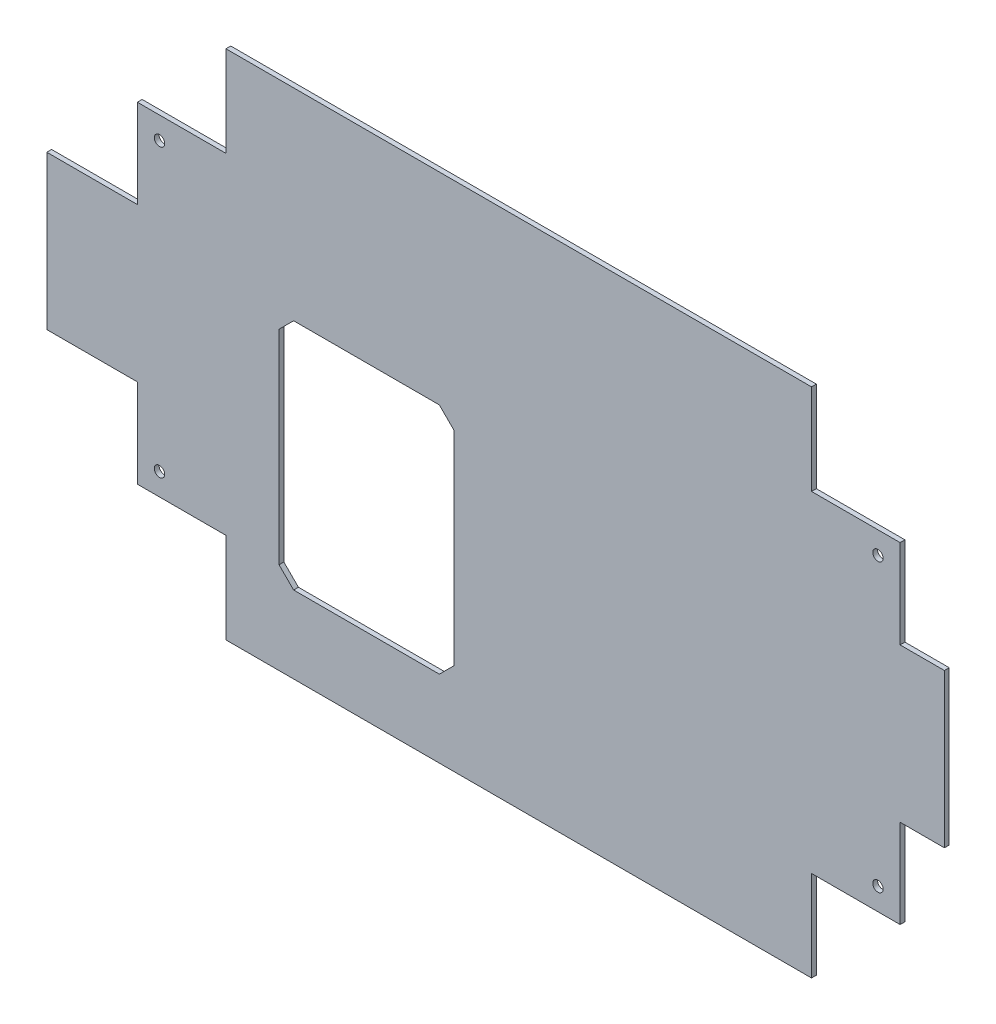
ISO-10303-21;
HEADER;
FILE_DESCRIPTION(('STEP AP214'),'2;1');
FILE_NAME('part.step','',(''),(''),'','','');
FILE_SCHEMA(('AUTOMOTIVE_DESIGN { 1 0 10303 214 1 1 1 1 }'));
ENDSEC;
DATA;
#1=APPLICATION_CONTEXT('core data for automotive mechanical design processes');
#2=APPLICATION_PROTOCOL_DEFINITION('international standard','automotive_design',2000,#1);
#3=PRODUCT_CONTEXT('',#1,'mechanical');
#4=PRODUCT('Part','Part','',(#3));
#5=PRODUCT_RELATED_PRODUCT_CATEGORY('part','',(#4));
#6=PRODUCT_DEFINITION_FORMATION('','',#4);
#7=PRODUCT_DEFINITION_CONTEXT('part definition',#1,'design');
#8=PRODUCT_DEFINITION('design','',#6,#7);
#9=PRODUCT_DEFINITION_SHAPE('','',#8);
#10=(LENGTH_UNIT() NAMED_UNIT(*) SI_UNIT(.MILLI.,.METRE.));
#11=(NAMED_UNIT(*) PLANE_ANGLE_UNIT() SI_UNIT($,.RADIAN.));
#12=(NAMED_UNIT(*) SI_UNIT($,.STERADIAN.) SOLID_ANGLE_UNIT());
#13=UNCERTAINTY_MEASURE_WITH_UNIT(LENGTH_MEASURE(1.E-05),#10,'distance_accuracy_value','');
#14=(GEOMETRIC_REPRESENTATION_CONTEXT(3) GLOBAL_UNCERTAINTY_ASSIGNED_CONTEXT((#13)) GLOBAL_UNIT_ASSIGNED_CONTEXT((#10,
#11,#12)) REPRESENTATION_CONTEXT('',''));
#15=CARTESIAN_POINT('',(0.,0.,0.));
#16=DIRECTION('',(0.,0.,1.));
#17=DIRECTION('',(1.,0.,0.));
#18=AXIS2_PLACEMENT_3D('',#15,#16,#17);
#19=CARTESIAN_POINT('',(-615.949999999996,52.7000000000001,3.3));
#20=DIRECTION('',(0.,-1.,0.));
#21=DIRECTION('',(1.,0.,0.));
#22=AXIS2_PLACEMENT_3D('',#19,#20,#21);
#23=PLANE('',#22);
#24=DIRECTION('',(-1.,0.,0.));
#25=VECTOR('',#24,1.);
#26=CARTESIAN_POINT('',(-615.949999999996,52.7000000000001,0.));
#27=LINE('',#26,#25);
#28=CARTESIAN_POINT('',(-553.799999999996,52.7,0.));
#29=VERTEX_POINT('',#28);
#30=CARTESIAN_POINT('',(-615.949999999996,52.7000000000001,0.));
#31=VERTEX_POINT('',#30);
#32=EDGE_CURVE('E288',#29,#31,#27,.T.);
#33=ORIENTED_EDGE('',*,*,#32,.T.);
#34=DIRECTION('',(0.,0.,-1.));
#35=VECTOR('',#34,1.);
#36=CARTESIAN_POINT('',(-615.949999999996,52.7000000000001,3.3));
#37=LINE('',#36,#35);
#38=CARTESIAN_POINT('',(-615.949999999996,52.7000000000001,3.3));
#39=VERTEX_POINT('',#38);
#40=EDGE_CURVE('E404',#39,#31,#37,.T.);
#41=ORIENTED_EDGE('',*,*,#40,.F.);
#42=DIRECTION('',(-1.,0.,0.));
#43=VECTOR('',#42,1.);
#44=CARTESIAN_POINT('',(-615.949999999996,52.7000000000001,3.3));
#45=LINE('',#44,#43);
#46=CARTESIAN_POINT('',(-553.799999999996,52.7,3.3));
#47=VERTEX_POINT('',#46);
#48=EDGE_CURVE('E290',#47,#39,#45,.T.);
#49=ORIENTED_EDGE('',*,*,#48,.F.);
#50=DIRECTION('',(0.,0.,-1.));
#51=VECTOR('',#50,1.);
#52=CARTESIAN_POINT('',(-553.799999999996,52.7,3.3));
#53=LINE('',#52,#51);
#54=EDGE_CURVE('E329',#47,#29,#53,.T.);
#55=ORIENTED_EDGE('',*,*,#54,.T.);
#56=EDGE_LOOP('',(#33,#41,#49,#55));
#57=FACE_BOUND('',#56,.T.);
#58=ADVANCED_FACE('F33',(#57),#23,.F.);
#59=CARTESIAN_POINT('',(-615.949999999996,52.7000000000001,3.3));
#60=DIRECTION('',(1.,0.,0.));
#61=DIRECTION('',(0.,0.,-1.));
#62=AXIS2_PLACEMENT_3D('',#59,#60,#61);
#63=PLANE('',#62);
#64=DIRECTION('',(0.,-1.,0.));
#65=VECTOR('',#64,1.);
#66=CARTESIAN_POINT('',(-615.949999999996,52.7000000000001,0.));
#67=LINE('',#66,#65);
#68=CARTESIAN_POINT('',(-615.949999999996,-52.6999999999999,0.));
#69=VERTEX_POINT('',#68);
#70=EDGE_CURVE('E332',#31,#69,#67,.T.);
#71=ORIENTED_EDGE('',*,*,#70,.T.);
#72=DIRECTION('',(0.,0.,-1.));
#73=VECTOR('',#72,1.);
#74=CARTESIAN_POINT('',(-615.949999999996,-52.6999999999999,3.3));
#75=LINE('',#74,#73);
#76=CARTESIAN_POINT('',(-615.949999999996,-52.6999999999999,3.3));
#77=VERTEX_POINT('',#76);
#78=EDGE_CURVE('E401',#77,#69,#75,.T.);
#79=ORIENTED_EDGE('',*,*,#78,.F.);
#80=DIRECTION('',(0.,-1.,0.));
#81=VECTOR('',#80,1.);
#82=CARTESIAN_POINT('',(-615.949999999996,52.7000000000001,3.3));
#83=LINE('',#82,#81);
#84=EDGE_CURVE('E293',#39,#77,#83,.T.);
#85=ORIENTED_EDGE('',*,*,#84,.F.);
#86=ORIENTED_EDGE('',*,*,#40,.T.);
#87=EDGE_LOOP('',(#71,#79,#85,#86));
#88=FACE_BOUND('',#87,.T.);
#89=ADVANCED_FACE('F488',(#88),#63,.F.);
#90=CARTESIAN_POINT('',(-615.949999999996,-52.6999999999999,3.3));
#91=DIRECTION('',(0.,1.,0.));
#92=DIRECTION('',(0.,0.,1.));
#93=AXIS2_PLACEMENT_3D('',#90,#91,#92);
#94=PLANE('',#93);
#95=DIRECTION('',(1.,0.,0.));
#96=VECTOR('',#95,1.);
#97=CARTESIAN_POINT('',(-615.949999999996,-52.6999999999999,0.));
#98=LINE('',#97,#96);
#99=CARTESIAN_POINT('',(-553.799999999996,-52.6999999999999,0.));
#100=VERTEX_POINT('',#99);
#101=EDGE_CURVE('E334',#69,#100,#98,.T.);
#102=ORIENTED_EDGE('',*,*,#101,.T.);
#103=DIRECTION('',(0.,0.,-1.));
#104=VECTOR('',#103,1.);
#105=CARTESIAN_POINT('',(-553.799999999996,-52.6999999999999,3.3));
#106=LINE('',#105,#104);
#107=CARTESIAN_POINT('',(-553.799999999996,-52.6999999999999,3.3));
#108=VERTEX_POINT('',#107);
#109=EDGE_CURVE('E398',#108,#100,#106,.T.);
#110=ORIENTED_EDGE('',*,*,#109,.F.);
#111=DIRECTION('',(1.,0.,0.));
#112=VECTOR('',#111,1.);
#113=CARTESIAN_POINT('',(-615.949999999996,-52.6999999999999,3.3));
#114=LINE('',#113,#112);
#115=EDGE_CURVE('E296',#77,#108,#114,.T.);
#116=ORIENTED_EDGE('',*,*,#115,.F.);
#117=ORIENTED_EDGE('',*,*,#78,.T.);
#118=EDGE_LOOP('',(#102,#110,#116,#117));
#119=FACE_BOUND('',#118,.T.);
#120=ADVANCED_FACE('F494',(#119),#94,.F.);
#121=CARTESIAN_POINT('',(-553.799999999996,-52.6999999999999,3.3));
#122=DIRECTION('',(1.,0.,0.));
#123=DIRECTION('',(0.,0.,-1.));
#124=AXIS2_PLACEMENT_3D('',#121,#122,#123);
#125=PLANE('',#124);
#126=DIRECTION('',(0.,-1.,0.));
#127=VECTOR('',#126,1.);
#128=CARTESIAN_POINT('',(-553.799999999996,-52.6999999999999,0.));
#129=LINE('',#128,#127);
#130=CARTESIAN_POINT('',(-553.799999999996,-113.5,0.));
#131=VERTEX_POINT('',#130);
#132=EDGE_CURVE('E336',#100,#131,#129,.T.);
#133=ORIENTED_EDGE('',*,*,#132,.T.);
#134=DIRECTION('',(0.,0.,-1.));
#135=VECTOR('',#134,1.);
#136=CARTESIAN_POINT('',(-553.799999999996,-113.5,3.3));
#137=LINE('',#136,#135);
#138=CARTESIAN_POINT('',(-553.799999999996,-113.5,3.3));
#139=VERTEX_POINT('',#138);
#140=EDGE_CURVE('E395',#139,#131,#137,.T.);
#141=ORIENTED_EDGE('',*,*,#140,.F.);
#142=DIRECTION('',(0.,-1.,0.));
#143=VECTOR('',#142,1.);
#144=CARTESIAN_POINT('',(-553.799999999996,-52.6999999999999,3.3));
#145=LINE('',#144,#143);
#146=EDGE_CURVE('E298',#108,#139,#145,.T.);
#147=ORIENTED_EDGE('',*,*,#146,.F.);
#148=ORIENTED_EDGE('',*,*,#109,.T.);
#149=EDGE_LOOP('',(#133,#141,#147,#148));
#150=FACE_BOUND('',#149,.T.);
#151=ADVANCED_FACE('F598',(#150),#125,.F.);
#152=CARTESIAN_POINT('',(-553.799999999996,-113.5,3.3));
#153=DIRECTION('',(0.,1.,0.));
#154=DIRECTION('',(-1.,0.,0.));
#155=AXIS2_PLACEMENT_3D('',#152,#153,#154);
#156=PLANE('',#155);
#157=DIRECTION('',(1.,0.,0.));
#158=VECTOR('',#157,1.);
#159=CARTESIAN_POINT('',(-553.799999999996,-113.5,0.));
#160=LINE('',#159,#158);
#161=CARTESIAN_POINT('',(-492.999999999998,-113.5,0.));
#162=VERTEX_POINT('',#161);
#163=EDGE_CURVE('E232',#131,#162,#160,.T.);
#164=ORIENTED_EDGE('',*,*,#163,.T.);
#165=DIRECTION('',(0.,0.,-1.));
#166=VECTOR('',#165,1.);
#167=CARTESIAN_POINT('',(-492.999999999998,-113.5,3.3));
#168=LINE('',#167,#166);
#169=CARTESIAN_POINT('',(-492.999999999998,-113.5,3.3));
#170=VERTEX_POINT('',#169);
#171=EDGE_CURVE('E227',#170,#162,#168,.T.);
#172=ORIENTED_EDGE('',*,*,#171,.F.);
#173=DIRECTION('',(1.,0.,0.));
#174=VECTOR('',#173,1.);
#175=CARTESIAN_POINT('',(-553.799999999996,-113.5,3.3));
#176=LINE('',#175,#174);
#177=EDGE_CURVE('E300',#139,#170,#176,.T.);
#178=ORIENTED_EDGE('',*,*,#177,.F.);
#179=ORIENTED_EDGE('',*,*,#140,.T.);
#180=EDGE_LOOP('',(#164,#172,#178,#179));
#181=FACE_BOUND('',#180,.T.);
#182=ADVANCED_FACE('F595',(#181),#156,.F.);
#183=CARTESIAN_POINT('',(-492.999999999998,-113.5,3.3));
#184=DIRECTION('',(1.,0.,0.));
#185=DIRECTION('',(0.,1.,0.));
#186=AXIS2_PLACEMENT_3D('',#183,#184,#185);
#187=PLANE('',#186);
#188=DIRECTION('',(0.,-1.,0.));
#189=VECTOR('',#188,1.);
#190=CARTESIAN_POINT('',(-492.999999999998,-113.5,0.));
#191=LINE('',#190,#189);
#192=CARTESIAN_POINT('',(-492.999999999998,-175.65,0.));
#193=VERTEX_POINT('',#192);
#194=EDGE_CURVE('E220',#162,#193,#191,.T.);
#195=ORIENTED_EDGE('',*,*,#194,.T.);
#196=DIRECTION('',(0.,0.,1.));
#197=VECTOR('',#196,1.);
#198=CARTESIAN_POINT('',(-492.999999999998,-175.65,0.));
#199=LINE('',#198,#197);
#200=CARTESIAN_POINT('',(-492.999999999998,-175.65,3.3));
#201=VERTEX_POINT('',#200);
#202=EDGE_CURVE('E224',#193,#201,#199,.T.);
#203=ORIENTED_EDGE('',*,*,#202,.T.);
#204=DIRECTION('',(0.,-1.,0.));
#205=VECTOR('',#204,1.);
#206=CARTESIAN_POINT('',(-492.999999999998,-113.5,3.3));
#207=LINE('',#206,#205);
#208=EDGE_CURVE('E302',#170,#201,#207,.T.);
#209=ORIENTED_EDGE('',*,*,#208,.F.);
#210=ORIENTED_EDGE('',*,*,#171,.T.);
#211=EDGE_LOOP('',(#195,#203,#209,#210));
#212=FACE_BOUND('',#211,.T.);
#213=ADVANCED_FACE('F222',(#212),#187,.F.);
#214=CARTESIAN_POINT('',(-91.2000000000021,-174.3,3.3));
#215=DIRECTION('',(-1.,0.,0.));
#216=DIRECTION('',(0.,0.,1.));
#217=AXIS2_PLACEMENT_3D('',#214,#215,#216);
#218=PLANE('',#217);
#219=DIRECTION('',(0.,1.,0.));
#220=VECTOR('',#219,1.);
#221=CARTESIAN_POINT('',(-91.2000000000021,-174.3,0.));
#222=LINE('',#221,#220);
#223=CARTESIAN_POINT('',(-91.2000000000021,-175.65,0.));
#224=VERTEX_POINT('',#223);
#225=CARTESIAN_POINT('',(-91.2000000000021,-113.5,0.));
#226=VERTEX_POINT('',#225);
#227=EDGE_CURVE('E231',#224,#226,#222,.T.);
#228=ORIENTED_EDGE('',*,*,#227,.T.);
#229=DIRECTION('',(0.,0.,-1.));
#230=VECTOR('',#229,1.);
#231=CARTESIAN_POINT('',(-91.2000000000021,-113.5,3.3));
#232=LINE('',#231,#230);
#233=CARTESIAN_POINT('',(-91.2000000000021,-113.5,3.3));
#234=VERTEX_POINT('',#233);
#235=EDGE_CURVE('E391',#234,#226,#232,.T.);
#236=ORIENTED_EDGE('',*,*,#235,.F.);
#237=DIRECTION('',(0.,1.,0.));
#238=VECTOR('',#237,1.);
#239=CARTESIAN_POINT('',(-91.2000000000021,-174.3,3.3));
#240=LINE('',#239,#238);
#241=CARTESIAN_POINT('',(-91.2000000000021,-175.65,3.3));
#242=VERTEX_POINT('',#241);
#243=EDGE_CURVE('E304',#242,#234,#240,.T.);
#244=ORIENTED_EDGE('',*,*,#243,.F.);
#245=DIRECTION('',(0.,0.,1.));
#246=VECTOR('',#245,1.);
#247=CARTESIAN_POINT('',(-91.2000000000021,-175.65,0.));
#248=LINE('',#247,#246);
#249=EDGE_CURVE('E241',#224,#242,#248,.T.);
#250=ORIENTED_EDGE('',*,*,#249,.F.);
#251=EDGE_LOOP('',(#228,#236,#244,#250));
#252=FACE_BOUND('',#251,.T.);
#253=ADVANCED_FACE('F588',(#252),#218,.F.);
#254=CARTESIAN_POINT('',(-91.2000000000021,-113.5,3.3));
#255=DIRECTION('',(0.,1.,0.));
#256=DIRECTION('',(-1.,0.,0.));
#257=AXIS2_PLACEMENT_3D('',#254,#255,#256);
#258=PLANE('',#257);
#259=DIRECTION('',(1.,0.,0.));
#260=VECTOR('',#259,1.);
#261=CARTESIAN_POINT('',(-91.2000000000021,-113.5,0.));
#262=LINE('',#261,#260);
#263=CARTESIAN_POINT('',(-30.4000000000042,-113.5,0.));
#264=VERTEX_POINT('',#263);
#265=EDGE_CURVE('E340',#226,#264,#262,.T.);
#266=ORIENTED_EDGE('',*,*,#265,.T.);
#267=DIRECTION('',(0.,0.,-1.));
#268=VECTOR('',#267,1.);
#269=CARTESIAN_POINT('',(-30.4000000000042,-113.5,3.3));
#270=LINE('',#269,#268);
#271=CARTESIAN_POINT('',(-30.4000000000042,-113.5,3.3));
#272=VERTEX_POINT('',#271);
#273=EDGE_CURVE('E388',#272,#264,#270,.T.);
#274=ORIENTED_EDGE('',*,*,#273,.F.);
#275=DIRECTION('',(1.,0.,0.));
#276=VECTOR('',#275,1.);
#277=CARTESIAN_POINT('',(-91.2000000000021,-113.5,3.3));
#278=LINE('',#277,#276);
#279=EDGE_CURVE('E306',#234,#272,#278,.T.);
#280=ORIENTED_EDGE('',*,*,#279,.F.);
#281=ORIENTED_EDGE('',*,*,#235,.T.);
#282=EDGE_LOOP('',(#266,#274,#280,#281));
#283=FACE_BOUND('',#282,.T.);
#284=ADVANCED_FACE('F584',(#283),#258,.F.);
#285=CARTESIAN_POINT('',(-30.4000000000042,-113.5,3.3));
#286=DIRECTION('',(-1.,0.,0.));
#287=DIRECTION('',(0.,0.,1.));
#288=AXIS2_PLACEMENT_3D('',#285,#286,#287);
#289=PLANE('',#288);
#290=DIRECTION('',(0.,1.,0.));
#291=VECTOR('',#290,1.);
#292=CARTESIAN_POINT('',(-30.4000000000042,-113.5,0.));
#293=LINE('',#292,#291);
#294=CARTESIAN_POINT('',(-30.4000000000042,-52.6999999999999,0.));
#295=VERTEX_POINT('',#294);
#296=EDGE_CURVE('E342',#264,#295,#293,.T.);
#297=ORIENTED_EDGE('',*,*,#296,.T.);
#298=DIRECTION('',(0.,0.,-1.));
#299=VECTOR('',#298,1.);
#300=CARTESIAN_POINT('',(-30.4000000000042,-52.6999999999999,3.3));
#301=LINE('',#300,#299);
#302=CARTESIAN_POINT('',(-30.4000000000042,-52.6999999999999,3.3));
#303=VERTEX_POINT('',#302);
#304=EDGE_CURVE('E385',#303,#295,#301,.T.);
#305=ORIENTED_EDGE('',*,*,#304,.F.);
#306=DIRECTION('',(0.,1.,0.));
#307=VECTOR('',#306,1.);
#308=CARTESIAN_POINT('',(-30.4000000000042,-113.5,3.3));
#309=LINE('',#308,#307);
#310=EDGE_CURVE('E308',#272,#303,#309,.T.);
#311=ORIENTED_EDGE('',*,*,#310,.F.);
#312=ORIENTED_EDGE('',*,*,#273,.T.);
#313=EDGE_LOOP('',(#297,#305,#311,#312));
#314=FACE_BOUND('',#313,.T.);
#315=ADVANCED_FACE('F580',(#314),#289,.F.);
#316=CARTESIAN_POINT('',(-30.4000000000042,-52.6999999999999,3.3));
#317=DIRECTION('',(0.,1.,0.));
#318=DIRECTION('',(-1.,0.,0.));
#319=AXIS2_PLACEMENT_3D('',#316,#317,#318);
#320=PLANE('',#319);
#321=DIRECTION('',(1.,0.,0.));
#322=VECTOR('',#321,1.);
#323=CARTESIAN_POINT('',(-30.4000000000042,-52.6999999999999,0.));
#324=LINE('',#323,#322);
#325=CARTESIAN_POINT('',(0.,-52.6999999999999,0.));
#326=VERTEX_POINT('',#325);
#327=EDGE_CURVE('E344',#295,#326,#324,.T.);
#328=ORIENTED_EDGE('',*,*,#327,.T.);
#329=DIRECTION('',(0.,0.,-1.));
#330=VECTOR('',#329,1.);
#331=CARTESIAN_POINT('',(0.,-52.6999999999999,3.3));
#332=LINE('',#331,#330);
#333=CARTESIAN_POINT('',(0.,-52.6999999999999,3.3));
#334=VERTEX_POINT('',#333);
#335=EDGE_CURVE('E382',#334,#326,#332,.T.);
#336=ORIENTED_EDGE('',*,*,#335,.F.);
#337=DIRECTION('',(1.,0.,0.));
#338=VECTOR('',#337,1.);
#339=CARTESIAN_POINT('',(-30.4000000000042,-52.6999999999999,3.3));
#340=LINE('',#339,#338);
#341=EDGE_CURVE('E310',#303,#334,#340,.T.);
#342=ORIENTED_EDGE('',*,*,#341,.F.);
#343=ORIENTED_EDGE('',*,*,#304,.T.);
#344=EDGE_LOOP('',(#328,#336,#342,#343));
#345=FACE_BOUND('',#344,.T.);
#346=ADVANCED_FACE('F576',(#345),#320,.F.);
#347=CARTESIAN_POINT('',(0.,-52.6999999999999,3.3));
#348=DIRECTION('',(-1.,0.,0.));
#349=DIRECTION('',(0.,-1.,0.));
#350=AXIS2_PLACEMENT_3D('',#347,#348,#349);
#351=PLANE('',#350);
#352=DIRECTION('',(0.,1.,0.));
#353=VECTOR('',#352,1.);
#354=CARTESIAN_POINT('',(0.,-52.6999999999999,0.));
#355=LINE('',#354,#353);
#356=CARTESIAN_POINT('',(0.,52.6999999999999,0.));
#357=VERTEX_POINT('',#356);
#358=EDGE_CURVE('E346',#326,#357,#355,.T.);
#359=ORIENTED_EDGE('',*,*,#358,.T.);
#360=DIRECTION('',(0.,0.,-1.));
#361=VECTOR('',#360,1.);
#362=CARTESIAN_POINT('',(0.,52.6999999999999,3.3));
#363=LINE('',#362,#361);
#364=CARTESIAN_POINT('',(0.,52.6999999999999,3.3));
#365=VERTEX_POINT('',#364);
#366=EDGE_CURVE('E379',#365,#357,#363,.T.);
#367=ORIENTED_EDGE('',*,*,#366,.F.);
#368=DIRECTION('',(0.,1.,0.));
#369=VECTOR('',#368,1.);
#370=CARTESIAN_POINT('',(0.,-52.6999999999999,3.3));
#371=LINE('',#370,#369);
#372=EDGE_CURVE('E312',#334,#365,#371,.T.);
#373=ORIENTED_EDGE('',*,*,#372,.F.);
#374=ORIENTED_EDGE('',*,*,#335,.T.);
#375=EDGE_LOOP('',(#359,#367,#373,#374));
#376=FACE_BOUND('',#375,.T.);
#377=ADVANCED_FACE('F572',(#376),#351,.F.);
#378=CARTESIAN_POINT('',(0.,52.6999999999999,3.3));
#379=DIRECTION('',(0.,-1.,0.));
#380=DIRECTION('',(0.,0.,-1.));
#381=AXIS2_PLACEMENT_3D('',#378,#379,#380);
#382=PLANE('',#381);
#383=DIRECTION('',(-1.,0.,0.));
#384=VECTOR('',#383,1.);
#385=CARTESIAN_POINT('',(0.,52.6999999999999,0.));
#386=LINE('',#385,#384);
#387=CARTESIAN_POINT('',(-30.4000000000042,52.6999999999999,0.));
#388=VERTEX_POINT('',#387);
#389=EDGE_CURVE('E348',#357,#388,#386,.T.);
#390=ORIENTED_EDGE('',*,*,#389,.T.);
#391=DIRECTION('',(0.,0.,-1.));
#392=VECTOR('',#391,1.);
#393=CARTESIAN_POINT('',(-30.4000000000042,52.6999999999999,3.3));
#394=LINE('',#393,#392);
#395=CARTESIAN_POINT('',(-30.4000000000042,52.6999999999999,3.3));
#396=VERTEX_POINT('',#395);
#397=EDGE_CURVE('E376',#396,#388,#394,.T.);
#398=ORIENTED_EDGE('',*,*,#397,.F.);
#399=DIRECTION('',(-1.,0.,0.));
#400=VECTOR('',#399,1.);
#401=CARTESIAN_POINT('',(0.,52.6999999999999,3.3));
#402=LINE('',#401,#400);
#403=EDGE_CURVE('E314',#365,#396,#402,.T.);
#404=ORIENTED_EDGE('',*,*,#403,.F.);
#405=ORIENTED_EDGE('',*,*,#366,.T.);
#406=EDGE_LOOP('',(#390,#398,#404,#405));
#407=FACE_BOUND('',#406,.T.);
#408=ADVANCED_FACE('F568',(#407),#382,.F.);
#409=CARTESIAN_POINT('',(-30.4000000000042,52.6999999999999,3.3));
#410=DIRECTION('',(-1.,0.,0.));
#411=DIRECTION('',(0.,-1.,0.));
#412=AXIS2_PLACEMENT_3D('',#409,#410,#411);
#413=PLANE('',#412);
#414=DIRECTION('',(0.,1.,0.));
#415=VECTOR('',#414,1.);
#416=CARTESIAN_POINT('',(-30.4000000000042,52.6999999999999,0.));
#417=LINE('',#416,#415);
#418=CARTESIAN_POINT('',(-30.4000000000041,113.5,0.));
#419=VERTEX_POINT('',#418);
#420=EDGE_CURVE('E350',#388,#419,#417,.T.);
#421=ORIENTED_EDGE('',*,*,#420,.T.);
#422=DIRECTION('',(0.,0.,-1.));
#423=VECTOR('',#422,1.);
#424=CARTESIAN_POINT('',(-30.4000000000041,113.5,3.3));
#425=LINE('',#424,#423);
#426=CARTESIAN_POINT('',(-30.4000000000041,113.5,3.3));
#427=VERTEX_POINT('',#426);
#428=EDGE_CURVE('E373',#427,#419,#425,.T.);
#429=ORIENTED_EDGE('',*,*,#428,.F.);
#430=DIRECTION('',(0.,1.,0.));
#431=VECTOR('',#430,1.);
#432=CARTESIAN_POINT('',(-30.4000000000042,52.6999999999999,3.3));
#433=LINE('',#432,#431);
#434=EDGE_CURVE('E316',#396,#427,#433,.T.);
#435=ORIENTED_EDGE('',*,*,#434,.F.);
#436=ORIENTED_EDGE('',*,*,#397,.T.);
#437=EDGE_LOOP('',(#421,#429,#435,#436));
#438=FACE_BOUND('',#437,.T.);
#439=ADVANCED_FACE('F564',(#438),#413,.F.);
#440=CARTESIAN_POINT('',(-30.4000000000041,113.5,3.3));
#441=DIRECTION('',(0.,-1.,0.));
#442=DIRECTION('',(1.,0.,0.));
#443=AXIS2_PLACEMENT_3D('',#440,#441,#442);
#444=PLANE('',#443);
#445=DIRECTION('',(-1.,0.,0.));
#446=VECTOR('',#445,1.);
#447=CARTESIAN_POINT('',(-30.4000000000041,113.5,0.));
#448=LINE('',#447,#446);
#449=CARTESIAN_POINT('',(-91.2000000000021,113.5,0.));
#450=VERTEX_POINT('',#449);
#451=EDGE_CURVE('E352',#419,#450,#448,.T.);
#452=ORIENTED_EDGE('',*,*,#451,.T.);
#453=DIRECTION('',(0.,0.,-1.));
#454=VECTOR('',#453,1.);
#455=CARTESIAN_POINT('',(-91.2000000000021,113.5,3.3));
#456=LINE('',#455,#454);
#457=CARTESIAN_POINT('',(-91.2000000000021,113.5,3.3));
#458=VERTEX_POINT('',#457);
#459=EDGE_CURVE('E370',#458,#450,#456,.T.);
#460=ORIENTED_EDGE('',*,*,#459,.F.);
#461=DIRECTION('',(-1.,0.,0.));
#462=VECTOR('',#461,1.);
#463=CARTESIAN_POINT('',(-30.4000000000041,113.5,3.3));
#464=LINE('',#463,#462);
#465=EDGE_CURVE('E318',#427,#458,#464,.T.);
#466=ORIENTED_EDGE('',*,*,#465,.F.);
#467=ORIENTED_EDGE('',*,*,#428,.T.);
#468=EDGE_LOOP('',(#452,#460,#466,#467));
#469=FACE_BOUND('',#468,.T.);
#470=ADVANCED_FACE('F560',(#469),#444,.F.);
#471=CARTESIAN_POINT('',(-91.2000000000021,113.5,3.3));
#472=DIRECTION('',(-1.,0.,0.));
#473=DIRECTION('',(0.,-1.,0.));
#474=AXIS2_PLACEMENT_3D('',#471,#472,#473);
#475=PLANE('',#474);
#476=DIRECTION('',(0.,1.,0.));
#477=VECTOR('',#476,1.);
#478=CARTESIAN_POINT('',(-91.2000000000021,113.5,0.));
#479=LINE('',#478,#477);
#480=CARTESIAN_POINT('',(-91.2000000000021,175.65,0.));
#481=VERTEX_POINT('',#480);
#482=EDGE_CURVE('E354',#450,#481,#479,.T.);
#483=ORIENTED_EDGE('',*,*,#482,.T.);
#484=DIRECTION('',(0.,0.,1.));
#485=VECTOR('',#484,1.);
#486=CARTESIAN_POINT('',(-91.2000000000021,175.65,0.));
#487=LINE('',#486,#485);
#488=CARTESIAN_POINT('',(-91.2000000000021,175.65,3.3));
#489=VERTEX_POINT('',#488);
#490=EDGE_CURVE('E285',#481,#489,#487,.T.);
#491=ORIENTED_EDGE('',*,*,#490,.T.);
#492=DIRECTION('',(0.,1.,0.));
#493=VECTOR('',#492,1.);
#494=CARTESIAN_POINT('',(-91.2000000000021,113.5,3.3));
#495=LINE('',#494,#493);
#496=EDGE_CURVE('E320',#458,#489,#495,.T.);
#497=ORIENTED_EDGE('',*,*,#496,.F.);
#498=ORIENTED_EDGE('',*,*,#459,.T.);
#499=EDGE_LOOP('',(#483,#491,#497,#498));
#500=FACE_BOUND('',#499,.T.);
#501=ADVANCED_FACE('F556',(#500),#475,.F.);
#502=CARTESIAN_POINT('',(-492.999999999998,113.5,3.3));
#503=DIRECTION('',(1.,0.,0.));
#504=DIRECTION('',(0.,0.,-1.));
#505=AXIS2_PLACEMENT_3D('',#502,#503,#504);
#506=PLANE('',#505);
#507=DIRECTION('',(0.,-1.,0.));
#508=VECTOR('',#507,1.);
#509=CARTESIAN_POINT('',(-492.999999999998,113.5,3.3));
#510=LINE('',#509,#508);
#511=CARTESIAN_POINT('',(-492.999999999998,175.65,3.3));
#512=VERTEX_POINT('',#511);
#513=CARTESIAN_POINT('',(-492.999999999998,113.5,3.3));
#514=VERTEX_POINT('',#513);
#515=EDGE_CURVE('E323',#512,#514,#510,.T.);
#516=ORIENTED_EDGE('',*,*,#515,.F.);
#517=DIRECTION('',(0.,0.,1.));
#518=VECTOR('',#517,1.);
#519=CARTESIAN_POINT('',(-492.999999999998,175.65,0.));
#520=LINE('',#519,#518);
#521=CARTESIAN_POINT('',(-492.999999999998,175.65,0.));
#522=VERTEX_POINT('',#521);
#523=EDGE_CURVE('E283',#522,#512,#520,.T.);
#524=ORIENTED_EDGE('',*,*,#523,.F.);
#525=DIRECTION('',(0.,-1.,0.));
#526=VECTOR('',#525,1.);
#527=CARTESIAN_POINT('',(-492.999999999998,113.5,0.));
#528=LINE('',#527,#526);
#529=CARTESIAN_POINT('',(-492.999999999998,113.5,0.));
#530=VERTEX_POINT('',#529);
#531=EDGE_CURVE('E357',#522,#530,#528,.T.);
#532=ORIENTED_EDGE('',*,*,#531,.T.);
#533=DIRECTION('',(0.,0.,-1.));
#534=VECTOR('',#533,1.);
#535=CARTESIAN_POINT('',(-492.999999999998,113.5,3.3));
#536=LINE('',#535,#534);
#537=EDGE_CURVE('E367',#514,#530,#536,.T.);
#538=ORIENTED_EDGE('',*,*,#537,.F.);
#539=EDGE_LOOP('',(#516,#524,#532,#538));
#540=FACE_BOUND('',#539,.T.);
#541=ADVANCED_FACE('F552',(#540),#506,.F.);
#542=CARTESIAN_POINT('',(-553.799999999996,113.5,3.3));
#543=DIRECTION('',(0.,-1.,0.));
#544=DIRECTION('',(1.,0.,0.));
#545=AXIS2_PLACEMENT_3D('',#542,#543,#544);
#546=PLANE('',#545);
#547=DIRECTION('',(-1.,0.,0.));
#548=VECTOR('',#547,1.);
#549=CARTESIAN_POINT('',(-553.799999999996,113.5,0.));
#550=LINE('',#549,#548);
#551=CARTESIAN_POINT('',(-553.799999999996,113.5,0.));
#552=VERTEX_POINT('',#551);
#553=EDGE_CURVE('E359',#530,#552,#550,.T.);
#554=ORIENTED_EDGE('',*,*,#553,.T.);
#555=DIRECTION('',(0.,0.,-1.));
#556=VECTOR('',#555,1.);
#557=CARTESIAN_POINT('',(-553.799999999996,113.5,3.3));
#558=LINE('',#557,#556);
#559=CARTESIAN_POINT('',(-553.799999999996,113.5,3.3));
#560=VERTEX_POINT('',#559);
#561=EDGE_CURVE('E364',#560,#552,#558,.T.);
#562=ORIENTED_EDGE('',*,*,#561,.F.);
#563=DIRECTION('',(-1.,0.,0.));
#564=VECTOR('',#563,1.);
#565=CARTESIAN_POINT('',(-553.799999999996,113.5,3.3));
#566=LINE('',#565,#564);
#567=EDGE_CURVE('E325',#514,#560,#566,.T.);
#568=ORIENTED_EDGE('',*,*,#567,.F.);
#569=ORIENTED_EDGE('',*,*,#537,.T.);
#570=EDGE_LOOP('',(#554,#562,#568,#569));
#571=FACE_BOUND('',#570,.T.);
#572=ADVANCED_FACE('F548',(#571),#546,.F.);
#573=CARTESIAN_POINT('',(-553.799999999996,52.7,3.3));
#574=DIRECTION('',(1.,0.,0.));
#575=DIRECTION('',(0.,0.,-1.));
#576=AXIS2_PLACEMENT_3D('',#573,#574,#575);
#577=PLANE('',#576);
#578=DIRECTION('',(0.,-1.,0.));
#579=VECTOR('',#578,1.);
#580=CARTESIAN_POINT('',(-553.799999999996,52.7,0.));
#581=LINE('',#580,#579);
#582=EDGE_CURVE('E294',#552,#29,#581,.T.);
#583=ORIENTED_EDGE('',*,*,#582,.T.);
#584=ORIENTED_EDGE('',*,*,#54,.F.);
#585=DIRECTION('',(0.,-1.,0.));
#586=VECTOR('',#585,1.);
#587=CARTESIAN_POINT('',(-553.799999999996,52.7,3.3));
#588=LINE('',#587,#586);
#589=EDGE_CURVE('E327',#560,#47,#588,.T.);
#590=ORIENTED_EDGE('',*,*,#589,.F.);
#591=ORIENTED_EDGE('',*,*,#561,.T.);
#592=EDGE_LOOP('',(#583,#584,#590,#591));
#593=FACE_BOUND('',#592,.T.);
#594=ADVANCED_FACE('F543',(#593),#577,.F.);
#595=CARTESIAN_POINT('',(0.,0.,3.3));
#596=DIRECTION('',(0.,0.,1.));
#597=DIRECTION('',(1.,0.,0.));
#598=AXIS2_PLACEMENT_3D('',#595,#596,#597);
#599=PLANE('',#598);
#600=DIRECTION('',(1.,0.,0.));
#601=VECTOR('',#600,1.);
#602=CARTESIAN_POINT('',(-456.566519886665,37.2316052691823,3.3));
#603=LINE('',#602,#601);
#604=CARTESIAN_POINT('',(-446.566519886665,37.2316052691823,3.3));
#605=VERTEX_POINT('',#604);
#606=CARTESIAN_POINT('',(-346.566519886665,37.2316052691823,3.3));
#607=VERTEX_POINT('',#606);
#608=EDGE_CURVE('E248',#605,#607,#603,.T.);
#609=ORIENTED_EDGE('',*,*,#608,.T.);
#610=DIRECTION('',(-0.707106781186544,0.707106781186551,0.));
#611=VECTOR('',#610,1.);
#612=CARTESIAN_POINT('',(-336.566519886665,27.2316052691822,3.3));
#613=LINE('',#612,#611);
#614=CARTESIAN_POINT('',(-336.566519886665,27.2316052691822,3.3));
#615=VERTEX_POINT('',#614);
#616=EDGE_CURVE('E11',#607,#615,#613,.F.);
#617=ORIENTED_EDGE('',*,*,#616,.T.);
#618=DIRECTION('',(0.,-1.,0.));
#619=VECTOR('',#618,1.);
#620=CARTESIAN_POINT('',(-336.566519886665,37.2316052691823,3.3));
#621=LINE('',#620,#619);
#622=CARTESIAN_POINT('',(-336.566519886665,-112.768394730818,3.3));
#623=VERTEX_POINT('',#622);
#624=EDGE_CURVE('E447',#615,#623,#621,.T.);
#625=ORIENTED_EDGE('',*,*,#624,.T.);
#626=DIRECTION('',(0.707106781186548,0.707106781186548,0.));
#627=VECTOR('',#626,1.);
#628=CARTESIAN_POINT('',(-346.566519886665,-122.768394730818,3.3));
#629=LINE('',#628,#627);
#630=CARTESIAN_POINT('',(-346.566519886665,-122.768394730818,3.3));
#631=VERTEX_POINT('',#630);
#632=EDGE_CURVE('E428',#623,#631,#629,.F.);
#633=ORIENTED_EDGE('',*,*,#632,.T.);
#634=DIRECTION('',(-1.,0.,0.));
#635=VECTOR('',#634,1.);
#636=CARTESIAN_POINT('',(-336.566519886665,-122.768394730818,3.3));
#637=LINE('',#636,#635);
#638=CARTESIAN_POINT('',(-446.566519886665,-122.768394730818,3.3));
#639=VERTEX_POINT('',#638);
#640=EDGE_CURVE('E458',#631,#639,#637,.T.);
#641=ORIENTED_EDGE('',*,*,#640,.T.);
#642=DIRECTION('',(0.707106781186544,-0.707106781186551,0.));
#643=VECTOR('',#642,1.);
#644=CARTESIAN_POINT('',(-456.566519886665,-112.768394730818,3.3));
#645=LINE('',#644,#643);
#646=CARTESIAN_POINT('',(-456.566519886665,-112.768394730818,3.3));
#647=VERTEX_POINT('',#646);
#648=EDGE_CURVE('E432',#639,#647,#645,.F.);
#649=ORIENTED_EDGE('',*,*,#648,.T.);
#650=DIRECTION('',(0.,1.,0.));
#651=VECTOR('',#650,1.);
#652=CARTESIAN_POINT('',(-456.566519886665,-122.768394730818,3.3));
#653=LINE('',#652,#651);
#654=CARTESIAN_POINT('',(-456.566519886665,27.2316052691822,3.3));
#655=VERTEX_POINT('',#654);
#656=EDGE_CURVE('E461',#647,#655,#653,.T.);
#657=ORIENTED_EDGE('',*,*,#656,.T.);
#658=DIRECTION('',(-0.707106781186547,-0.707106781186548,0.));
#659=VECTOR('',#658,1.);
#660=CARTESIAN_POINT('',(-446.566519886665,37.2316052691823,3.3));
#661=LINE('',#660,#659);
#662=EDGE_CURVE('E55',#655,#605,#661,.F.);
#663=ORIENTED_EDGE('',*,*,#662,.T.);
#664=EDGE_LOOP('',(#609,#617,#625,#633,#641,#649,#657,#663));
#665=FACE_BOUND('',#664,.T.);
#666=CARTESIAN_POINT('',(-45.6000000000042,98.3,3.3));
#667=DIRECTION('',(0.,0.,-1.));
#668=DIRECTION('',(-1.,0.,0.));
#669=AXIS2_PLACEMENT_3D('',#666,#667,#668);
#670=CIRCLE('',#669,3.57123999999999);
#671=CARTESIAN_POINT('',(-49.1712400000042,98.3,3.3));
#672=VERTEX_POINT('',#671);
#673=EDGE_CURVE('E258',#672,#672,#670,.T.);
#674=ORIENTED_EDGE('',*,*,#673,.T.);
#675=EDGE_LOOP('',(#674));
#676=FACE_BOUND('',#675,.T.);
#677=CARTESIAN_POINT('',(-45.6000000000084,-98.3000000000018,3.3));
#678=DIRECTION('',(0.,0.,-1.));
#679=DIRECTION('',(-1.,0.,0.));
#680=AXIS2_PLACEMENT_3D('',#677,#678,#679);
#681=CIRCLE('',#680,3.57123999999999);
#682=CARTESIAN_POINT('',(-49.1712400000084,-98.3000000000018,3.3));
#683=VERTEX_POINT('',#682);
#684=EDGE_CURVE('E264',#683,#683,#681,.T.);
#685=ORIENTED_EDGE('',*,*,#684,.T.);
#686=EDGE_LOOP('',(#685));
#687=FACE_BOUND('',#686,.T.);
#688=CARTESIAN_POINT('',(-538.600000000004,-98.2999999999998,3.3));
#689=DIRECTION('',(0.,0.,-1.));
#690=DIRECTION('',(-1.,0.,0.));
#691=AXIS2_PLACEMENT_3D('',#688,#689,#690);
#692=CIRCLE('',#691,3.57123999999998);
#693=CARTESIAN_POINT('',(-542.171240000004,-98.2999999999998,3.3));
#694=VERTEX_POINT('',#693);
#695=EDGE_CURVE('E270',#694,#694,#692,.T.);
#696=ORIENTED_EDGE('',*,*,#695,.T.);
#697=EDGE_LOOP('',(#696));
#698=FACE_BOUND('',#697,.T.);
#699=CARTESIAN_POINT('',(-538.600000000004,98.3000000000002,3.3));
#700=DIRECTION('',(0.,0.,-1.));
#701=DIRECTION('',(-1.,0.,0.));
#702=AXIS2_PLACEMENT_3D('',#699,#700,#701);
#703=CIRCLE('',#702,3.57123999999998);
#704=CARTESIAN_POINT('',(-542.171240000004,98.3000000000002,3.3));
#705=VERTEX_POINT('',#704);
#706=EDGE_CURVE('E276',#705,#705,#703,.T.);
#707=ORIENTED_EDGE('',*,*,#706,.T.);
#708=EDGE_LOOP('',(#707));
#709=FACE_BOUND('',#708,.T.);
#710=DIRECTION('',(1.,0.,0.));
#711=VECTOR('',#710,1.);
#712=CARTESIAN_POINT('',(-492.999999999998,175.65,3.3));
#713=LINE('',#712,#711);
#714=EDGE_CURVE('E279',#512,#489,#713,.T.);
#715=ORIENTED_EDGE('',*,*,#714,.F.);
#716=ORIENTED_EDGE('',*,*,#515,.T.);
#717=ORIENTED_EDGE('',*,*,#567,.T.);
#718=ORIENTED_EDGE('',*,*,#589,.T.);
#719=ORIENTED_EDGE('',*,*,#48,.T.);
#720=ORIENTED_EDGE('',*,*,#84,.T.);
#721=ORIENTED_EDGE('',*,*,#115,.T.);
#722=ORIENTED_EDGE('',*,*,#146,.T.);
#723=ORIENTED_EDGE('',*,*,#177,.T.);
#724=ORIENTED_EDGE('',*,*,#208,.T.);
#725=DIRECTION('',(1.,0.,0.));
#726=VECTOR('',#725,1.);
#727=CARTESIAN_POINT('',(-492.999999999998,-175.65,3.3));
#728=LINE('',#727,#726);
#729=EDGE_CURVE('E240',#201,#242,#728,.T.);
#730=ORIENTED_EDGE('',*,*,#729,.T.);
#731=ORIENTED_EDGE('',*,*,#243,.T.);
#732=ORIENTED_EDGE('',*,*,#279,.T.);
#733=ORIENTED_EDGE('',*,*,#310,.T.);
#734=ORIENTED_EDGE('',*,*,#341,.T.);
#735=ORIENTED_EDGE('',*,*,#372,.T.);
#736=ORIENTED_EDGE('',*,*,#403,.T.);
#737=ORIENTED_EDGE('',*,*,#434,.T.);
#738=ORIENTED_EDGE('',*,*,#465,.T.);
#739=ORIENTED_EDGE('',*,*,#496,.T.);
#740=EDGE_LOOP('',(#715,#716,#717,#718,#719,#720,#721,#722,#723,#724,#730,#731,#732,#733,#734,
#735,#736,#737,#738,#739));
#741=FACE_BOUND('',#740,.T.);
#742=ADVANCED_FACE('F452',(#665,#676,#687,#698,#709,#741),#599,.T.);
#743=CARTESIAN_POINT('',(0.,0.,0.));
#744=DIRECTION('',(0.,0.,1.));
#745=DIRECTION('',(1.,0.,0.));
#746=AXIS2_PLACEMENT_3D('',#743,#744,#745);
#747=PLANE('',#746);
#748=DIRECTION('',(-1.,0.,0.));
#749=VECTOR('',#748,1.);
#750=CARTESIAN_POINT('',(-336.566519886665,-122.768394730818,0.));
#751=LINE('',#750,#749);
#752=CARTESIAN_POINT('',(-346.566519886665,-122.768394730818,0.));
#753=VERTEX_POINT('',#752);
#754=CARTESIAN_POINT('',(-446.566519886665,-122.768394730818,0.));
#755=VERTEX_POINT('',#754);
#756=EDGE_CURVE('E467',#753,#755,#751,.T.);
#757=ORIENTED_EDGE('',*,*,#756,.F.);
#758=DIRECTION('',(-0.707106781186548,-0.707106781186548,0.));
#759=VECTOR('',#758,1.);
#760=CARTESIAN_POINT('',(-111.899062577924,111.899062577924,0.));
#761=LINE('',#760,#759);
#762=CARTESIAN_POINT('',(-336.566519886665,-112.768394730818,0.));
#763=VERTEX_POINT('',#762);
#764=EDGE_CURVE('E426',#753,#763,#761,.F.);
#765=ORIENTED_EDGE('',*,*,#764,.T.);
#766=DIRECTION('',(0.,-1.,0.));
#767=VECTOR('',#766,1.);
#768=CARTESIAN_POINT('',(-336.566519886665,37.2316052691823,0.));
#769=LINE('',#768,#767);
#770=CARTESIAN_POINT('',(-336.566519886665,27.2316052691822,0.));
#771=VERTEX_POINT('',#770);
#772=EDGE_CURVE('E442',#771,#763,#769,.T.);
#773=ORIENTED_EDGE('',*,*,#772,.F.);
#774=DIRECTION('',(0.707106781186544,-0.707106781186551,0.));
#775=VECTOR('',#774,1.);
#776=CARTESIAN_POINT('',(-154.667457308743,-154.667457308742,0.));
#777=LINE('',#776,#775);
#778=CARTESIAN_POINT('',(-346.566519886665,37.2316052691823,0.));
#779=VERTEX_POINT('',#778);
#780=EDGE_CURVE('E41',#771,#779,#777,.F.);
#781=ORIENTED_EDGE('',*,*,#780,.T.);
#782=DIRECTION('',(1.,0.,0.));
#783=VECTOR('',#782,1.);
#784=CARTESIAN_POINT('',(-456.566519886665,37.2316052691823,0.));
#785=LINE('',#784,#783);
#786=CARTESIAN_POINT('',(-446.566519886665,37.2316052691823,0.));
#787=VERTEX_POINT('',#786);
#788=EDGE_CURVE('E251',#787,#779,#785,.T.);
#789=ORIENTED_EDGE('',*,*,#788,.F.);
#790=DIRECTION('',(0.707106781186547,0.707106781186548,0.));
#791=VECTOR('',#790,1.);
#792=CARTESIAN_POINT('',(-241.899062577924,241.899062577924,0.));
#793=LINE('',#792,#791);
#794=CARTESIAN_POINT('',(-456.566519886665,27.2316052691822,0.));
#795=VERTEX_POINT('',#794);
#796=EDGE_CURVE('E434',#787,#795,#793,.F.);
#797=ORIENTED_EDGE('',*,*,#796,.T.);
#798=DIRECTION('',(0.,1.,0.));
#799=VECTOR('',#798,1.);
#800=CARTESIAN_POINT('',(-456.566519886665,-122.768394730818,0.));
#801=LINE('',#800,#799);
#802=CARTESIAN_POINT('',(-456.566519886665,-112.768394730818,0.));
#803=VERTEX_POINT('',#802);
#804=EDGE_CURVE('E448',#803,#795,#801,.T.);
#805=ORIENTED_EDGE('',*,*,#804,.F.);
#806=DIRECTION('',(-0.707106781186544,0.707106781186551,0.));
#807=VECTOR('',#806,1.);
#808=CARTESIAN_POINT('',(-284.667457308744,-284.667457308741,0.));
#809=LINE('',#808,#807);
#810=EDGE_CURVE('E430',#803,#755,#809,.F.);
#811=ORIENTED_EDGE('',*,*,#810,.T.);
#812=EDGE_LOOP('',(#757,#765,#773,#781,#789,#797,#805,#811));
#813=FACE_BOUND('',#812,.T.);
#814=CARTESIAN_POINT('',(-45.6000000000042,98.3,0.));
#815=DIRECTION('',(0.,0.,-1.));
#816=DIRECTION('',(-1.,0.,0.));
#817=AXIS2_PLACEMENT_3D('',#814,#815,#816);
#818=CIRCLE('',#817,3.57123999999999);
#819=CARTESIAN_POINT('',(-49.1712400000042,98.3,0.));
#820=VERTEX_POINT('',#819);
#821=EDGE_CURVE('E254',#820,#820,#818,.T.);
#822=ORIENTED_EDGE('',*,*,#821,.F.);
#823=EDGE_LOOP('',(#822));
#824=FACE_BOUND('',#823,.T.);
#825=CARTESIAN_POINT('',(-45.6000000000084,-98.3000000000018,0.));
#826=DIRECTION('',(0.,0.,-1.));
#827=DIRECTION('',(-1.,0.,0.));
#828=AXIS2_PLACEMENT_3D('',#825,#826,#827);
#829=CIRCLE('',#828,3.57123999999999);
#830=CARTESIAN_POINT('',(-49.1712400000084,-98.3000000000018,0.));
#831=VERTEX_POINT('',#830);
#832=EDGE_CURVE('E261',#831,#831,#829,.T.);
#833=ORIENTED_EDGE('',*,*,#832,.F.);
#834=EDGE_LOOP('',(#833));
#835=FACE_BOUND('',#834,.T.);
#836=CARTESIAN_POINT('',(-538.600000000004,-98.2999999999998,0.));
#837=DIRECTION('',(0.,0.,-1.));
#838=DIRECTION('',(-1.,0.,0.));
#839=AXIS2_PLACEMENT_3D('',#836,#837,#838);
#840=CIRCLE('',#839,3.57123999999998);
#841=CARTESIAN_POINT('',(-542.171240000004,-98.2999999999998,0.));
#842=VERTEX_POINT('',#841);
#843=EDGE_CURVE('E267',#842,#842,#840,.T.);
#844=ORIENTED_EDGE('',*,*,#843,.F.);
#845=EDGE_LOOP('',(#844));
#846=FACE_BOUND('',#845,.T.);
#847=CARTESIAN_POINT('',(-538.600000000004,98.3000000000002,0.));
#848=DIRECTION('',(0.,0.,-1.));
#849=DIRECTION('',(-1.,0.,0.));
#850=AXIS2_PLACEMENT_3D('',#847,#848,#849);
#851=CIRCLE('',#850,3.57123999999998);
#852=CARTESIAN_POINT('',(-542.171240000004,98.3000000000002,0.));
#853=VERTEX_POINT('',#852);
#854=EDGE_CURVE('E273',#853,#853,#851,.T.);
#855=ORIENTED_EDGE('',*,*,#854,.F.);
#856=EDGE_LOOP('',(#855));
#857=FACE_BOUND('',#856,.T.);
#858=ORIENTED_EDGE('',*,*,#531,.F.);
#859=DIRECTION('',(1.,0.,0.));
#860=VECTOR('',#859,1.);
#861=CARTESIAN_POINT('',(-492.999999999998,175.65,0.));
#862=LINE('',#861,#860);
#863=EDGE_CURVE('E280',#522,#481,#862,.T.);
#864=ORIENTED_EDGE('',*,*,#863,.T.);
#865=ORIENTED_EDGE('',*,*,#482,.F.);
#866=ORIENTED_EDGE('',*,*,#451,.F.);
#867=ORIENTED_EDGE('',*,*,#420,.F.);
#868=ORIENTED_EDGE('',*,*,#389,.F.);
#869=ORIENTED_EDGE('',*,*,#358,.F.);
#870=ORIENTED_EDGE('',*,*,#327,.F.);
#871=ORIENTED_EDGE('',*,*,#296,.F.);
#872=ORIENTED_EDGE('',*,*,#265,.F.);
#873=ORIENTED_EDGE('',*,*,#227,.F.);
#874=DIRECTION('',(1.,0.,0.));
#875=VECTOR('',#874,1.);
#876=CARTESIAN_POINT('',(-492.999999999998,-175.65,0.));
#877=LINE('',#876,#875);
#878=EDGE_CURVE('E238',#193,#224,#877,.T.);
#879=ORIENTED_EDGE('',*,*,#878,.F.);
#880=ORIENTED_EDGE('',*,*,#194,.F.);
#881=ORIENTED_EDGE('',*,*,#163,.F.);
#882=ORIENTED_EDGE('',*,*,#132,.F.);
#883=ORIENTED_EDGE('',*,*,#101,.F.);
#884=ORIENTED_EDGE('',*,*,#70,.F.);
#885=ORIENTED_EDGE('',*,*,#32,.F.);
#886=ORIENTED_EDGE('',*,*,#582,.F.);
#887=ORIENTED_EDGE('',*,*,#553,.F.);
#888=EDGE_LOOP('',(#858,#864,#865,#866,#867,#868,#869,#870,#871,#872,#873,#879,#880,#881,#882,
#883,#884,#885,#886,#887));
#889=FACE_BOUND('',#888,.T.);
#890=ADVANCED_FACE('F244',(#813,#824,#835,#846,#857,#889),#747,.F.);
#891=CARTESIAN_POINT('',(-492.999999999998,175.65,0.));
#892=DIRECTION('',(0.,-1.,0.));
#893=DIRECTION('',(0.,0.,-1.));
#894=AXIS2_PLACEMENT_3D('',#891,#892,#893);
#895=PLANE('',#894);
#896=ORIENTED_EDGE('',*,*,#714,.T.);
#897=ORIENTED_EDGE('',*,*,#490,.F.);
#898=ORIENTED_EDGE('',*,*,#863,.F.);
#899=ORIENTED_EDGE('',*,*,#523,.T.);
#900=EDGE_LOOP('',(#896,#897,#898,#899));
#901=FACE_BOUND('',#900,.T.);
#902=ADVANCED_FACE('F536',(#901),#895,.F.);
#903=CARTESIAN_POINT('',(-538.600000000004,98.3000000000002,0.));
#904=DIRECTION('',(0.,0.,-1.));
#905=DIRECTION('',(-1.,0.,0.));
#906=AXIS2_PLACEMENT_3D('',#903,#904,#905);
#907=CYLINDRICAL_SURFACE('',#906,3.57123999999998);
#908=ORIENTED_EDGE('',*,*,#706,.F.);
#909=EDGE_LOOP('',(#908));
#910=FACE_BOUND('',#909,.T.);
#911=ORIENTED_EDGE('',*,*,#854,.T.);
#912=EDGE_LOOP('',(#911));
#913=FACE_BOUND('',#912,.T.);
#914=ADVANCED_FACE('F532',(#910,#913),#907,.F.);
#915=CARTESIAN_POINT('',(-538.600000000004,-98.2999999999998,0.));
#916=DIRECTION('',(0.,0.,-1.));
#917=DIRECTION('',(-1.,0.,0.));
#918=AXIS2_PLACEMENT_3D('',#915,#916,#917);
#919=CYLINDRICAL_SURFACE('',#918,3.57123999999998);
#920=ORIENTED_EDGE('',*,*,#695,.F.);
#921=EDGE_LOOP('',(#920));
#922=FACE_BOUND('',#921,.T.);
#923=ORIENTED_EDGE('',*,*,#843,.T.);
#924=EDGE_LOOP('',(#923));
#925=FACE_BOUND('',#924,.T.);
#926=ADVANCED_FACE('F528',(#922,#925),#919,.F.);
#927=CARTESIAN_POINT('',(-45.6000000000084,-98.3000000000018,0.));
#928=DIRECTION('',(0.,0.,-1.));
#929=DIRECTION('',(-1.,0.,0.));
#930=AXIS2_PLACEMENT_3D('',#927,#928,#929);
#931=CYLINDRICAL_SURFACE('',#930,3.57123999999999);
#932=ORIENTED_EDGE('',*,*,#684,.F.);
#933=EDGE_LOOP('',(#932));
#934=FACE_BOUND('',#933,.T.);
#935=ORIENTED_EDGE('',*,*,#832,.T.);
#936=EDGE_LOOP('',(#935));
#937=FACE_BOUND('',#936,.T.);
#938=ADVANCED_FACE('F524',(#934,#937),#931,.F.);
#939=CARTESIAN_POINT('',(-45.6000000000042,98.3,0.));
#940=DIRECTION('',(0.,0.,-1.));
#941=DIRECTION('',(-1.,0.,0.));
#942=AXIS2_PLACEMENT_3D('',#939,#940,#941);
#943=CYLINDRICAL_SURFACE('',#942,3.57123999999999);
#944=ORIENTED_EDGE('',*,*,#673,.F.);
#945=EDGE_LOOP('',(#944));
#946=FACE_BOUND('',#945,.T.);
#947=ORIENTED_EDGE('',*,*,#821,.T.);
#948=EDGE_LOOP('',(#947));
#949=FACE_BOUND('',#948,.T.);
#950=ADVANCED_FACE('F521',(#946,#949),#943,.F.);
#951=CARTESIAN_POINT('',(-492.999999999998,-175.65,0.));
#952=DIRECTION('',(0.,-1.,0.));
#953=DIRECTION('',(0.,0.,-1.));
#954=AXIS2_PLACEMENT_3D('',#951,#952,#953);
#955=PLANE('',#954);
#956=ORIENTED_EDGE('',*,*,#729,.F.);
#957=ORIENTED_EDGE('',*,*,#202,.F.);
#958=ORIENTED_EDGE('',*,*,#878,.T.);
#959=ORIENTED_EDGE('',*,*,#249,.T.);
#960=EDGE_LOOP('',(#956,#957,#958,#959));
#961=FACE_BOUND('',#960,.T.);
#962=ADVANCED_FACE('F236',(#961),#955,.T.);
#963=CARTESIAN_POINT('',(-336.566519886665,37.2316052691823,3.3));
#964=DIRECTION('',(1.,0.,0.));
#965=DIRECTION('',(0.,0.,-1.));
#966=AXIS2_PLACEMENT_3D('',#963,#964,#965);
#967=PLANE('',#966);
#968=ORIENTED_EDGE('',*,*,#772,.T.);
#969=DIRECTION('',(0.,0.,1.));
#970=VECTOR('',#969,1.);
#971=CARTESIAN_POINT('',(-336.566519886665,-112.768394730818,3.3));
#972=LINE('',#971,#970);
#973=EDGE_CURVE('E415',#763,#623,#972,.T.);
#974=ORIENTED_EDGE('',*,*,#973,.T.);
#975=ORIENTED_EDGE('',*,*,#624,.F.);
#976=DIRECTION('',(0.,0.,-1.));
#977=VECTOR('',#976,1.);
#978=CARTESIAN_POINT('',(-336.566519886665,27.2316052691822,0.));
#979=LINE('',#978,#977);
#980=EDGE_CURVE('E412',#615,#771,#979,.T.);
#981=ORIENTED_EDGE('',*,*,#980,.T.);
#982=EDGE_LOOP('',(#968,#974,#975,#981));
#983=FACE_BOUND('',#982,.T.);
#984=ADVANCED_FACE('F456',(#983),#967,.F.);
#985=CARTESIAN_POINT('',(-456.566519886665,37.2316052691823,3.3));
#986=DIRECTION('',(0.,1.,0.));
#987=DIRECTION('',(0.,0.,1.));
#988=AXIS2_PLACEMENT_3D('',#985,#986,#987);
#989=PLANE('',#988);
#990=ORIENTED_EDGE('',*,*,#608,.F.);
#991=DIRECTION('',(0.,0.,-1.));
#992=VECTOR('',#991,1.);
#993=CARTESIAN_POINT('',(-446.566519886665,37.2316052691823,0.));
#994=LINE('',#993,#992);
#995=EDGE_CURVE('E423',#605,#787,#994,.T.);
#996=ORIENTED_EDGE('',*,*,#995,.T.);
#997=ORIENTED_EDGE('',*,*,#788,.T.);
#998=DIRECTION('',(0.,0.,1.));
#999=VECTOR('',#998,1.);
#1000=CARTESIAN_POINT('',(-346.566519886665,37.2316052691823,3.3));
#1001=LINE('',#1000,#999);
#1002=EDGE_CURVE('E48',#779,#607,#1001,.T.);
#1003=ORIENTED_EDGE('',*,*,#1002,.T.);
#1004=EDGE_LOOP('',(#990,#996,#997,#1003));
#1005=FACE_BOUND('',#1004,.T.);
#1006=ADVANCED_FACE('F445',(#1005),#989,.F.);
#1007=CARTESIAN_POINT('',(-456.566519886665,-122.768394730818,3.3));
#1008=DIRECTION('',(-1.,0.,0.));
#1009=DIRECTION('',(0.,0.,1.));
#1010=AXIS2_PLACEMENT_3D('',#1007,#1008,#1009);
#1011=PLANE('',#1010);
#1012=ORIENTED_EDGE('',*,*,#656,.F.);
#1013=DIRECTION('',(0.,0.,-1.));
#1014=VECTOR('',#1013,1.);
#1015=CARTESIAN_POINT('',(-456.566519886665,-112.768394730818,0.));
#1016=LINE('',#1015,#1014);
#1017=EDGE_CURVE('E419',#647,#803,#1016,.T.);
#1018=ORIENTED_EDGE('',*,*,#1017,.T.);
#1019=ORIENTED_EDGE('',*,*,#804,.T.);
#1020=DIRECTION('',(0.,0.,1.));
#1021=VECTOR('',#1020,1.);
#1022=CARTESIAN_POINT('',(-456.566519886665,27.2316052691822,3.3));
#1023=LINE('',#1022,#1021);
#1024=EDGE_CURVE('E417',#795,#655,#1023,.T.);
#1025=ORIENTED_EDGE('',*,*,#1024,.T.);
#1026=EDGE_LOOP('',(#1012,#1018,#1019,#1025));
#1027=FACE_BOUND('',#1026,.T.);
#1028=ADVANCED_FACE('F474',(#1027),#1011,.F.);
#1029=CARTESIAN_POINT('',(-336.566519886665,-122.768394730818,3.3));
#1030=DIRECTION('',(0.,-1.,0.));
#1031=DIRECTION('',(0.,0.,-1.));
#1032=AXIS2_PLACEMENT_3D('',#1029,#1030,#1031);
#1033=PLANE('',#1032);
#1034=ORIENTED_EDGE('',*,*,#640,.F.);
#1035=DIRECTION('',(0.,0.,-1.));
#1036=VECTOR('',#1035,1.);
#1037=CARTESIAN_POINT('',(-346.566519886665,-122.768394730818,0.));
#1038=LINE('',#1037,#1036);
#1039=EDGE_CURVE('E409',#631,#753,#1038,.T.);
#1040=ORIENTED_EDGE('',*,*,#1039,.T.);
#1041=ORIENTED_EDGE('',*,*,#756,.T.);
#1042=DIRECTION('',(0.,0.,1.));
#1043=VECTOR('',#1042,1.);
#1044=CARTESIAN_POINT('',(-446.566519886665,-122.768394730818,3.3));
#1045=LINE('',#1044,#1043);
#1046=EDGE_CURVE('E407',#755,#639,#1045,.T.);
#1047=ORIENTED_EDGE('',*,*,#1046,.T.);
#1048=EDGE_LOOP('',(#1034,#1040,#1041,#1047));
#1049=FACE_BOUND('',#1048,.T.);
#1050=ADVANCED_FACE('F500',(#1049),#1033,.F.);
#1051=CARTESIAN_POINT('',(-346.566519886665,-122.768394730818,3.3));
#1052=DIRECTION('',(-0.707106781186547,0.707106781186547,0.));
#1053=DIRECTION('',(0.,0.,1.));
#1054=AXIS2_PLACEMENT_3D('',#1051,#1052,#1053);
#1055=PLANE('',#1054);
#1056=ORIENTED_EDGE('',*,*,#632,.F.);
#1057=ORIENTED_EDGE('',*,*,#973,.F.);
#1058=ORIENTED_EDGE('',*,*,#764,.F.);
#1059=ORIENTED_EDGE('',*,*,#1039,.F.);
#1060=EDGE_LOOP('',(#1056,#1057,#1058,#1059));
#1061=FACE_BOUND('',#1060,.T.);
#1062=ADVANCED_FACE('F484',(#1061),#1055,.T.);
#1063=CARTESIAN_POINT('',(-456.566519886665,-112.768394730818,3.3));
#1064=DIRECTION('',(0.707106781186551,0.707106781186544,0.));
#1065=DIRECTION('',(0.,0.,1.));
#1066=AXIS2_PLACEMENT_3D('',#1063,#1064,#1065);
#1067=PLANE('',#1066);
#1068=ORIENTED_EDGE('',*,*,#648,.F.);
#1069=ORIENTED_EDGE('',*,*,#1046,.F.);
#1070=ORIENTED_EDGE('',*,*,#810,.F.);
#1071=ORIENTED_EDGE('',*,*,#1017,.F.);
#1072=EDGE_LOOP('',(#1068,#1069,#1070,#1071));
#1073=FACE_BOUND('',#1072,.T.);
#1074=ADVANCED_FACE('F479',(#1073),#1067,.T.);
#1075=CARTESIAN_POINT('',(-446.566519886665,37.2316052691823,3.3));
#1076=DIRECTION('',(0.707106781186548,-0.707106781186547,0.));
#1077=DIRECTION('',(0.,0.,1.));
#1078=AXIS2_PLACEMENT_3D('',#1075,#1076,#1077);
#1079=PLANE('',#1078);
#1080=ORIENTED_EDGE('',*,*,#662,.F.);
#1081=ORIENTED_EDGE('',*,*,#1024,.F.);
#1082=ORIENTED_EDGE('',*,*,#796,.F.);
#1083=ORIENTED_EDGE('',*,*,#995,.F.);
#1084=EDGE_LOOP('',(#1080,#1081,#1082,#1083));
#1085=FACE_BOUND('',#1084,.T.);
#1086=ADVANCED_FACE('F477',(#1085),#1079,.T.);
#1087=CARTESIAN_POINT('',(-336.566519886665,27.2316052691822,3.3));
#1088=DIRECTION('',(-0.707106781186551,-0.707106781186543,0.));
#1089=DIRECTION('',(0.,0.,1.));
#1090=AXIS2_PLACEMENT_3D('',#1087,#1088,#1089);
#1091=PLANE('',#1090);
#1092=ORIENTED_EDGE('',*,*,#616,.F.);
#1093=ORIENTED_EDGE('',*,*,#1002,.F.);
#1094=ORIENTED_EDGE('',*,*,#780,.F.);
#1095=ORIENTED_EDGE('',*,*,#980,.F.);
#1096=EDGE_LOOP('',(#1092,#1093,#1094,#1095));
#1097=FACE_BOUND('',#1096,.T.);
#1098=ADVANCED_FACE('F35',(#1097),#1091,.T.);
#1099=CLOSED_SHELL('',(#58,#89,#120,#151,#182,#213,#253,#284,#315,#346,#377,#408,#439,#470,#501,
#541,#572,#594,#742,#890,#902,#914,#926,#938,#950,#962,#984,#1006,#1028,#1050,#1062,#1074,#1086,#1098));
#1100=MANIFOLD_SOLID_BREP('B2',#1099);
#1101=ADVANCED_BREP_SHAPE_REPRESENTATION('',(#18,#1100),#14);
#1102=SHAPE_DEFINITION_REPRESENTATION(#9,#1101);
ENDSEC;
END-ISO-10303-21;
